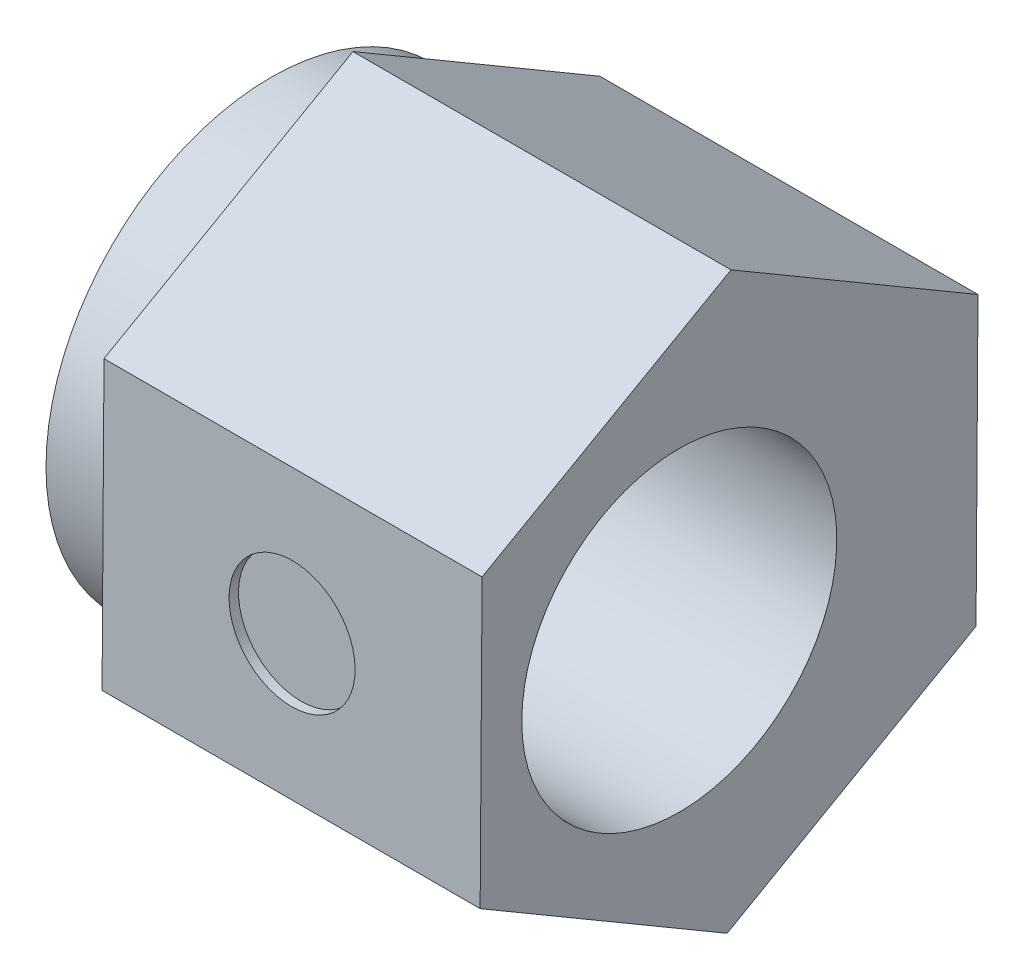
ISO-10303-21;
HEADER;
FILE_DESCRIPTION(('STEP AP214'),'2;1');
FILE_NAME('part.step','',(''),(''),'','','');
FILE_SCHEMA(('AUTOMOTIVE_DESIGN { 1 0 10303 214 1 1 1 1 }'));
ENDSEC;
DATA;
#1=APPLICATION_CONTEXT('core data for automotive mechanical design processes');
#2=APPLICATION_PROTOCOL_DEFINITION('international standard','automotive_design',2000,#1);
#3=PRODUCT_CONTEXT('',#1,'mechanical');
#4=PRODUCT('Part','Part','',(#3));
#5=PRODUCT_RELATED_PRODUCT_CATEGORY('part','',(#4));
#6=PRODUCT_DEFINITION_FORMATION('','',#4);
#7=PRODUCT_DEFINITION_CONTEXT('part definition',#1,'design');
#8=PRODUCT_DEFINITION('design','',#6,#7);
#9=PRODUCT_DEFINITION_SHAPE('','',#8);
#10=(LENGTH_UNIT() NAMED_UNIT(*) SI_UNIT(.MILLI.,.METRE.));
#11=(NAMED_UNIT(*) PLANE_ANGLE_UNIT() SI_UNIT($,.RADIAN.));
#12=(NAMED_UNIT(*) SI_UNIT($,.STERADIAN.) SOLID_ANGLE_UNIT());
#13=UNCERTAINTY_MEASURE_WITH_UNIT(LENGTH_MEASURE(1.E-05),#10,'distance_accuracy_value','');
#14=(GEOMETRIC_REPRESENTATION_CONTEXT(3) GLOBAL_UNCERTAINTY_ASSIGNED_CONTEXT((#13)) GLOBAL_UNIT_ASSIGNED_CONTEXT((#10,
#11,#12)) REPRESENTATION_CONTEXT('',''));
#15=CARTESIAN_POINT('',(0.,0.,0.));
#16=DIRECTION('',(0.,0.,1.));
#17=DIRECTION('',(1.,0.,0.));
#18=AXIS2_PLACEMENT_3D('',#15,#16,#17);
#19=CARTESIAN_POINT('',(6.,2.29861751972744,3.91943756568916));
#20=DIRECTION('',(0.,-0.00680988299330344,-0.999976812477978));
#21=DIRECTION('',(0.,0.999976812477978,-0.00680988299330344));
#22=AXIS2_PLACEMENT_3D('',#19,#20,#21);
#23=PLANE('',#22);
#24=DIRECTION('',(0.,-0.999976812477978,0.00680988299330344));
#25=VECTOR('',#24,1.);
#26=CARTESIAN_POINT('',(0.,2.29861751972744,3.91943756568916));
#27=LINE('',#26,#25);
#28=CARTESIAN_POINT('',(0.,2.29861751972744,3.91943756568916));
#29=VERTEX_POINT('',#28);
#30=CARTESIAN_POINT('',(0.,-2.24502374057014,3.95037994851252));
#31=VERTEX_POINT('',#30);
#32=EDGE_CURVE('E73',#29,#31,#27,.T.);
#33=ORIENTED_EDGE('',*,*,#32,.T.);
#34=DIRECTION('',(-1.,0.,0.));
#35=VECTOR('',#34,1.);
#36=CARTESIAN_POINT('',(6.,-2.24502374057014,3.95037994851252));
#37=LINE('',#36,#35);
#38=CARTESIAN_POINT('',(6.,-2.24502374057014,3.95037994851252));
#39=VERTEX_POINT('',#38);
#40=EDGE_CURVE('E111',#39,#31,#37,.T.);
#41=ORIENTED_EDGE('',*,*,#40,.F.);
#42=DIRECTION('',(0.,-0.999976812477978,0.00680988299330344));
#43=VECTOR('',#42,1.);
#44=CARTESIAN_POINT('',(6.,2.29861751972744,3.91943756568916));
#45=LINE('',#44,#43);
#46=CARTESIAN_POINT('',(6.,2.29861751972744,3.91943756568916));
#47=VERTEX_POINT('',#46);
#48=EDGE_CURVE('E99',#47,#39,#45,.T.);
#49=ORIENTED_EDGE('',*,*,#48,.F.);
#50=DIRECTION('',(-1.,0.,0.));
#51=VECTOR('',#50,1.);
#52=CARTESIAN_POINT('',(6.,2.29861751972744,3.91943756568916));
#53=LINE('',#52,#51);
#54=EDGE_CURVE('E106',#47,#29,#53,.T.);
#55=ORIENTED_EDGE('',*,*,#54,.T.);
#56=EDGE_LOOP('',(#33,#41,#49,#55));
#57=FACE_BOUND('',#56,.T.);
#58=CARTESIAN_POINT('',(3.,0.026796889578649,3.93490875710084));
#59=DIRECTION('',(0.,-0.00680988299330344,-0.999976812477978));
#60=DIRECTION('',(0.,0.999976812477978,-0.00680988299330344));
#61=AXIS2_PLACEMENT_3D('',#58,#59,#60);
#62=CIRCLE('',#61,0.999999999999998);
#63=CARTESIAN_POINT('',(3.,-0.973179922899328,3.94171864009414));
#64=VERTEX_POINT('',#63);
#65=EDGE_CURVE('E159',#64,#64,#62,.T.);
#66=ORIENTED_EDGE('',*,*,#65,.T.);
#67=EDGE_LOOP('',(#66));
#68=FACE_BOUND('',#67,.T.);
#69=ADVANCED_FACE('F33',(#57,#68),#23,.F.);
#70=CARTESIAN_POINT('',(0.,0.,0.));
#71=DIRECTION('',(1.,0.,0.));
#72=DIRECTION('',(0.,0.,-1.));
#73=AXIS2_PLACEMENT_3D('',#70,#71,#72);
#74=PLANE('',#73);
#75=DIRECTION('',(0.,0.494090874569989,-0.869410264297968));
#76=VECTOR('',#75,1.);
#77=CARTESIAN_POINT('',(0.,-4.54364126029758,0.0309423828233433));
#78=LINE('',#77,#76);
#79=CARTESIAN_POINT('',(0.,-4.54364126029758,0.0309423828233433));
#80=VERTEX_POINT('',#79);
#81=CARTESIAN_POINT('',(0.,-2.29861751972745,-3.91943756568916));
#82=VERTEX_POINT('',#81);
#83=EDGE_CURVE('E119',#80,#82,#78,.T.);
#84=ORIENTED_EDGE('',*,*,#83,.F.);
#85=DIRECTION('',(0.,-0.50588593790799,-0.862600381304665));
#86=VECTOR('',#85,1.);
#87=CARTESIAN_POINT('',(0.,-2.24502374057014,3.95037994851252));
#88=LINE('',#87,#86);
#89=EDGE_CURVE('E79',#31,#80,#88,.T.);
#90=ORIENTED_EDGE('',*,*,#89,.F.);
#91=ORIENTED_EDGE('',*,*,#32,.F.);
#92=DIRECTION('',(0.,-0.494090874569989,0.869410264297968));
#93=VECTOR('',#92,1.);
#94=CARTESIAN_POINT('',(0.,4.54364126029758,-0.0309423828233572));
#95=LINE('',#94,#93);
#96=CARTESIAN_POINT('',(0.,4.54364126029758,-0.0309423828233572));
#97=VERTEX_POINT('',#96);
#98=EDGE_CURVE('E109',#97,#29,#95,.T.);
#99=ORIENTED_EDGE('',*,*,#98,.F.);
#100=DIRECTION('',(0.,0.505885937907989,0.862600381304665));
#101=VECTOR('',#100,1.);
#102=CARTESIAN_POINT('',(0.,2.24502374057014,-3.95037994851252));
#103=LINE('',#102,#101);
#104=CARTESIAN_POINT('',(0.,2.24502374057014,-3.95037994851252));
#105=VERTEX_POINT('',#104);
#106=EDGE_CURVE('E125',#105,#97,#103,.T.);
#107=ORIENTED_EDGE('',*,*,#106,.F.);
#108=DIRECTION('',(0.,0.999976812477978,-0.00680988299330266));
#109=VECTOR('',#108,1.);
#110=CARTESIAN_POINT('',(0.,-2.29861751972745,-3.91943756568916));
#111=LINE('',#110,#109);
#112=EDGE_CURVE('E122',#82,#105,#111,.T.);
#113=ORIENTED_EDGE('',*,*,#112,.F.);
#114=EDGE_LOOP('',(#84,#90,#91,#99,#107,#113));
#115=FACE_BOUND('',#114,.T.);
#116=CARTESIAN_POINT('',(0.,0.,0.));
#117=DIRECTION('',(1.,0.,0.));
#118=DIRECTION('',(0.,0.,-1.));
#119=AXIS2_PLACEMENT_3D('',#116,#117,#118);
#120=CIRCLE('',#119,3.57);
#121=CARTESIAN_POINT('',(0.,0.,-3.57));
#122=VERTEX_POINT('',#121);
#123=EDGE_CURVE('E11',#122,#122,#120,.F.);
#124=ORIENTED_EDGE('',*,*,#123,.F.);
#125=EDGE_LOOP('',(#124));
#126=FACE_BOUND('',#125,.T.);
#127=ADVANCED_FACE('F142',(#115,#126),#74,.F.);
#128=CARTESIAN_POINT('',(6.,-4.54364126029758,0.0309423828233433));
#129=DIRECTION('',(0.,0.869410264297968,0.494090874569989));
#130=DIRECTION('',(0.,-0.494090874569989,0.869410264297969));
#131=AXIS2_PLACEMENT_3D('',#128,#129,#130);
#132=PLANE('',#131);
#133=ORIENTED_EDGE('',*,*,#83,.T.);
#134=DIRECTION('',(-1.,0.,0.));
#135=VECTOR('',#134,1.);
#136=CARTESIAN_POINT('',(6.,-2.29861751972745,-3.91943756568916));
#137=LINE('',#136,#135);
#138=CARTESIAN_POINT('',(6.,-2.29861751972745,-3.91943756568916));
#139=VERTEX_POINT('',#138);
#140=EDGE_CURVE('E42',#139,#82,#137,.T.);
#141=ORIENTED_EDGE('',*,*,#140,.F.);
#142=DIRECTION('',(0.,0.494090874569989,-0.869410264297968));
#143=VECTOR('',#142,1.);
#144=CARTESIAN_POINT('',(6.,-4.54364126029758,0.0309423828233433));
#145=LINE('',#144,#143);
#146=CARTESIAN_POINT('',(6.,-4.54364126029758,0.0309423828233433));
#147=VERTEX_POINT('',#146);
#148=EDGE_CURVE('E130',#147,#139,#145,.T.);
#149=ORIENTED_EDGE('',*,*,#148,.F.);
#150=DIRECTION('',(-1.,0.,0.));
#151=VECTOR('',#150,1.);
#152=CARTESIAN_POINT('',(6.,-4.54364126029758,0.0309423828233433));
#153=LINE('',#152,#151);
#154=EDGE_CURVE('E115',#147,#80,#153,.T.);
#155=ORIENTED_EDGE('',*,*,#154,.T.);
#156=EDGE_LOOP('',(#133,#141,#149,#155));
#157=FACE_BOUND('',#156,.T.);
#158=ADVANCED_FACE('F35',(#157),#132,.F.);
#159=CARTESIAN_POINT('',(6.,-2.29861751972745,-3.91943756568916));
#160=DIRECTION('',(0.,0.00680988299330266,0.999976812477978));
#161=DIRECTION('',(0.,-0.999976812477978,0.00680988299330266));
#162=AXIS2_PLACEMENT_3D('',#159,#160,#161);
#163=PLANE('',#162);
#164=ORIENTED_EDGE('',*,*,#112,.T.);
#165=DIRECTION('',(-1.,0.,0.));
#166=VECTOR('',#165,1.);
#167=CARTESIAN_POINT('',(6.,2.24502374057014,-3.95037994851252));
#168=LINE('',#167,#166);
#169=CARTESIAN_POINT('',(6.,2.24502374057014,-3.95037994851252));
#170=VERTEX_POINT('',#169);
#171=EDGE_CURVE('E134',#170,#105,#168,.T.);
#172=ORIENTED_EDGE('',*,*,#171,.F.);
#173=DIRECTION('',(0.,0.999976812477978,-0.00680988299330266));
#174=VECTOR('',#173,1.);
#175=CARTESIAN_POINT('',(6.,-2.29861751972745,-3.91943756568916));
#176=LINE('',#175,#174);
#177=EDGE_CURVE('E88',#139,#170,#176,.T.);
#178=ORIENTED_EDGE('',*,*,#177,.F.);
#179=ORIENTED_EDGE('',*,*,#140,.T.);
#180=EDGE_LOOP('',(#164,#172,#178,#179));
#181=FACE_BOUND('',#180,.T.);
#182=ADVANCED_FACE('F137',(#181),#163,.F.);
#183=CARTESIAN_POINT('',(6.,2.24502374057014,-3.95037994851252));
#184=DIRECTION('',(0.,-0.862600381304665,0.50588593790799));
#185=DIRECTION('',(0.,-0.50588593790799,-0.862600381304665));
#186=AXIS2_PLACEMENT_3D('',#183,#184,#185);
#187=PLANE('',#186);
#188=ORIENTED_EDGE('',*,*,#106,.T.);
#189=DIRECTION('',(-1.,0.,0.));
#190=VECTOR('',#189,1.);
#191=CARTESIAN_POINT('',(6.,4.54364126029758,-0.0309423828233572));
#192=LINE('',#191,#190);
#193=CARTESIAN_POINT('',(6.,4.54364126029758,-0.0309423828233572));
#194=VERTEX_POINT('',#193);
#195=EDGE_CURVE('E110',#194,#97,#192,.T.);
#196=ORIENTED_EDGE('',*,*,#195,.F.);
#197=DIRECTION('',(0.,0.505885937907989,0.862600381304665));
#198=VECTOR('',#197,1.);
#199=CARTESIAN_POINT('',(6.,2.24502374057014,-3.95037994851252));
#200=LINE('',#199,#198);
#201=EDGE_CURVE('E101',#170,#194,#200,.T.);
#202=ORIENTED_EDGE('',*,*,#201,.F.);
#203=ORIENTED_EDGE('',*,*,#171,.T.);
#204=EDGE_LOOP('',(#188,#196,#202,#203));
#205=FACE_BOUND('',#204,.T.);
#206=ADVANCED_FACE('F146',(#205),#187,.F.);
#207=CARTESIAN_POINT('',(6.,4.54364126029758,-0.0309423828233572));
#208=DIRECTION('',(0.,-0.869410264297968,-0.494090874569989));
#209=DIRECTION('',(0.,0.494090874569989,-0.869410264297969));
#210=AXIS2_PLACEMENT_3D('',#207,#208,#209);
#211=PLANE('',#210);
#212=ORIENTED_EDGE('',*,*,#98,.T.);
#213=ORIENTED_EDGE('',*,*,#54,.F.);
#214=DIRECTION('',(0.,-0.494090874569989,0.869410264297968));
#215=VECTOR('',#214,1.);
#216=CARTESIAN_POINT('',(6.,4.54364126029758,-0.0309423828233572));
#217=LINE('',#216,#215);
#218=EDGE_CURVE('E95',#194,#47,#217,.T.);
#219=ORIENTED_EDGE('',*,*,#218,.F.);
#220=ORIENTED_EDGE('',*,*,#195,.T.);
#221=EDGE_LOOP('',(#212,#213,#219,#220));
#222=FACE_BOUND('',#221,.T.);
#223=ADVANCED_FACE('F107',(#222),#211,.F.);
#224=CARTESIAN_POINT('',(6.,-2.24502374057014,3.95037994851252));
#225=DIRECTION('',(0.,0.862600381304665,-0.50588593790799));
#226=DIRECTION('',(0.,0.50588593790799,0.862600381304665));
#227=AXIS2_PLACEMENT_3D('',#224,#225,#226);
#228=PLANE('',#227);
#229=ORIENTED_EDGE('',*,*,#89,.T.);
#230=ORIENTED_EDGE('',*,*,#154,.F.);
#231=DIRECTION('',(0.,-0.50588593790799,-0.862600381304665));
#232=VECTOR('',#231,1.);
#233=CARTESIAN_POINT('',(6.,-2.24502374057014,3.95037994851252));
#234=LINE('',#233,#232);
#235=EDGE_CURVE('E50',#39,#147,#234,.T.);
#236=ORIENTED_EDGE('',*,*,#235,.F.);
#237=ORIENTED_EDGE('',*,*,#40,.T.);
#238=EDGE_LOOP('',(#229,#230,#236,#237));
#239=FACE_BOUND('',#238,.T.);
#240=ADVANCED_FACE('F184',(#239),#228,.F.);
#241=CARTESIAN_POINT('',(6.,0.,0.));
#242=DIRECTION('',(1.,0.,0.));
#243=DIRECTION('',(0.,0.,-1.));
#244=AXIS2_PLACEMENT_3D('',#241,#242,#243);
#245=PLANE('',#244);
#246=CARTESIAN_POINT('',(6.,0.,0.79));
#247=DIRECTION('',(-1.,0.,0.));
#248=DIRECTION('',(0.,0.,1.));
#249=AXIS2_PLACEMENT_3D('',#246,#247,#248);
#250=CIRCLE('',#249,2.5);
#251=CARTESIAN_POINT('',(6.,0.,3.29));
#252=VERTEX_POINT('',#251);
#253=EDGE_CURVE('E152',#252,#252,#250,.T.);
#254=ORIENTED_EDGE('',*,*,#253,.T.);
#255=EDGE_LOOP('',(#254));
#256=FACE_BOUND('',#255,.T.);
#257=ORIENTED_EDGE('',*,*,#148,.T.);
#258=ORIENTED_EDGE('',*,*,#177,.T.);
#259=ORIENTED_EDGE('',*,*,#201,.T.);
#260=ORIENTED_EDGE('',*,*,#218,.T.);
#261=ORIENTED_EDGE('',*,*,#48,.T.);
#262=ORIENTED_EDGE('',*,*,#235,.T.);
#263=EDGE_LOOP('',(#257,#258,#259,#260,#261,#262));
#264=FACE_BOUND('',#263,.T.);
#265=ADVANCED_FACE('F97',(#256,#264),#245,.T.);
#266=CARTESIAN_POINT('',(-1.27,0.,0.));
#267=DIRECTION('',(1.,0.,0.));
#268=DIRECTION('',(0.,0.,-1.));
#269=AXIS2_PLACEMENT_3D('',#266,#267,#268);
#270=CYLINDRICAL_SURFACE('',#269,3.57);
#271=CARTESIAN_POINT('',(-1.27,0.,0.));
#272=DIRECTION('',(-1.,0.,0.));
#273=DIRECTION('',(0.,0.,1.));
#274=AXIS2_PLACEMENT_3D('',#271,#272,#273);
#275=CIRCLE('',#274,3.57);
#276=CARTESIAN_POINT('',(-1.27,0.,3.57));
#277=VERTEX_POINT('',#276);
#278=EDGE_CURVE('E123',#277,#277,#275,.T.);
#279=ORIENTED_EDGE('',*,*,#278,.F.);
#280=EDGE_LOOP('',(#279));
#281=FACE_BOUND('',#280,.T.);
#282=ORIENTED_EDGE('',*,*,#123,.T.);
#283=EDGE_LOOP('',(#282));
#284=FACE_BOUND('',#283,.T.);
#285=ADVANCED_FACE('F210',(#281,#284),#270,.T.);
#286=CARTESIAN_POINT('',(-1.27,0.,0.));
#287=DIRECTION('',(-1.,0.,0.));
#288=DIRECTION('',(0.,0.,1.));
#289=AXIS2_PLACEMENT_3D('',#286,#287,#288);
#290=PLANE('',#289);
#291=CARTESIAN_POINT('',(-1.27,0.,0.79));
#292=DIRECTION('',(-1.,0.,0.));
#293=DIRECTION('',(0.,0.,1.));
#294=AXIS2_PLACEMENT_3D('',#291,#292,#293);
#295=CIRCLE('',#294,2.5);
#296=CARTESIAN_POINT('',(-1.27,0.,3.29));
#297=VERTEX_POINT('',#296);
#298=EDGE_CURVE('E153',#297,#297,#295,.T.);
#299=ORIENTED_EDGE('',*,*,#298,.F.);
#300=EDGE_LOOP('',(#299));
#301=FACE_BOUND('',#300,.T.);
#302=ORIENTED_EDGE('',*,*,#278,.T.);
#303=EDGE_LOOP('',(#302));
#304=FACE_BOUND('',#303,.T.);
#305=ADVANCED_FACE('F214',(#301,#304),#290,.T.);
#306=CARTESIAN_POINT('',(6.,0.,0.79));
#307=DIRECTION('',(-1.,0.,0.));
#308=DIRECTION('',(0.,0.,1.));
#309=AXIS2_PLACEMENT_3D('',#306,#307,#308);
#310=CYLINDRICAL_SURFACE('',#309,2.5);
#311=ORIENTED_EDGE('',*,*,#253,.F.);
#312=EDGE_LOOP('',(#311));
#313=FACE_BOUND('',#312,.T.);
#314=ORIENTED_EDGE('',*,*,#298,.T.);
#315=EDGE_LOOP('',(#314));
#316=FACE_BOUND('',#315,.T.);
#317=ADVANCED_FACE('F174',(#313,#316),#310,.F.);
#318=CARTESIAN_POINT('',(3.,0.0257754071296535,3.78491223522914));
#319=DIRECTION('',(0.,0.00680988299330344,0.999976812477978));
#320=DIRECTION('',(0.,-0.999976812477978,0.00680988299330344));
#321=AXIS2_PLACEMENT_3D('',#318,#319,#320);
#322=CYLINDRICAL_SURFACE('',#321,0.999999999999998);
#323=CARTESIAN_POINT('',(3.,0.0257754071296535,3.78491223522914));
#324=DIRECTION('',(0.,-0.00680988299330344,-0.999976812477978));
#325=DIRECTION('',(0.,0.999976812477978,-0.00680988299330344));
#326=AXIS2_PLACEMENT_3D('',#323,#324,#325);
#327=CIRCLE('',#326,0.999999999999998);
#328=CARTESIAN_POINT('',(3.,-0.974201405348323,3.79172211822245));
#329=VERTEX_POINT('',#328);
#330=EDGE_CURVE('E156',#329,#329,#327,.T.);
#331=CARTESIAN_POINT('',(3.,-0.974201405348323,3.79172211822245));
#332=CARTESIAN_POINT('',(3.,-0.974190764906146,3.79328458199194));
#333=CARTESIAN_POINT('',(3.,-0.974180124463969,3.79484704576144));
#334=CARTESIAN_POINT('',(3.,-0.974158843579615,3.79797197330043));
#335=CARTESIAN_POINT('',(3.,-0.974148203137438,3.79953443706993));
#336=CARTESIAN_POINT('',(3.,-0.974126922253084,3.80265936460892));
#337=CARTESIAN_POINT('',(3.,-0.974116281810907,3.80422182837842));
#338=CARTESIAN_POINT('',(3.,-0.974095000926553,3.80734675591741));
#339=CARTESIAN_POINT('',(3.,-0.974084360484376,3.80890921968691));
#340=CARTESIAN_POINT('',(3.,-0.974063079600021,3.8120341472259));
#341=CARTESIAN_POINT('',(3.,-0.974052439157845,3.8135966109954));
#342=CARTESIAN_POINT('',(3.,-0.97403115827349,3.8167215385344));
#343=CARTESIAN_POINT('',(3.,-0.974020517831313,3.81828400230389));
#344=CARTESIAN_POINT('',(3.,-0.973999236946959,3.82140892984289));
#345=CARTESIAN_POINT('',(3.,-0.973988596504782,3.82297139361238));
#346=CARTESIAN_POINT('',(3.,-0.973967315620428,3.82609632115138));
#347=CARTESIAN_POINT('',(3.,-0.973956675178251,3.82765878492087));
#348=CARTESIAN_POINT('',(3.,-0.973935394293897,3.83078371245987));
#349=CARTESIAN_POINT('',(3.,-0.97392475385172,3.83234617622936));
#350=CARTESIAN_POINT('',(3.,-0.973903472967366,3.83547110376836));
#351=CARTESIAN_POINT('',(3.,-0.973892832525189,3.83703356753785));
#352=CARTESIAN_POINT('',(3.,-0.973871551640835,3.84015849507685));
#353=CARTESIAN_POINT('',(3.,-0.973860911198658,3.84172095884634));
#354=CARTESIAN_POINT('',(3.,-0.973839630314304,3.84484588638534));
#355=CARTESIAN_POINT('',(3.,-0.973828989872127,3.84640835015484));
#356=CARTESIAN_POINT('',(3.,-0.973807708987773,3.84953327769383));
#357=CARTESIAN_POINT('',(3.,-0.973797068545596,3.85109574146333));
#358=CARTESIAN_POINT('',(3.,-0.973775787661241,3.85422066900232));
#359=CARTESIAN_POINT('',(3.,-0.973765147219064,3.85578313277182));
#360=CARTESIAN_POINT('',(3.,-0.97374386633471,3.85890806031081));
#361=CARTESIAN_POINT('',(3.,-0.973733225892534,3.86047052408031));
#362=CARTESIAN_POINT('',(3.,-0.973711945008179,3.8635954516193));
#363=CARTESIAN_POINT('',(3.,-0.973701304566002,3.8651579153888));
#364=CARTESIAN_POINT('',(3.,-0.973680023681648,3.86828284292779));
#365=CARTESIAN_POINT('',(3.,-0.973669383239471,3.86984530669729));
#366=CARTESIAN_POINT('',(3.,-0.973648102355117,3.87297023423628));
#367=CARTESIAN_POINT('',(3.,-0.97363746191294,3.87453269800578));
#368=CARTESIAN_POINT('',(3.,-0.973616181028586,3.87765762554477));
#369=CARTESIAN_POINT('',(3.,-0.973605540586409,3.87922008931427));
#370=CARTESIAN_POINT('',(3.,-0.973584259702055,3.88234501685326));
#371=CARTESIAN_POINT('',(3.,-0.973573619259878,3.88390748062276));
#372=CARTESIAN_POINT('',(3.,-0.973552338375524,3.88703240816175));
#373=CARTESIAN_POINT('',(3.,-0.973541697933347,3.88859487193125));
#374=CARTESIAN_POINT('',(3.,-0.973520417048993,3.89171979947024));
#375=CARTESIAN_POINT('',(3.,-0.973509776606816,3.89328226323974));
#376=CARTESIAN_POINT('',(3.,-0.973488495722461,3.89640719077873));
#377=CARTESIAN_POINT('',(3.,-0.973477855280285,3.89796965454823));
#378=CARTESIAN_POINT('',(3.,-0.97345657439593,3.90109458208722));
#379=CARTESIAN_POINT('',(3.,-0.973445933953753,3.90265704585672));
#380=CARTESIAN_POINT('',(3.,-0.973424653069399,3.90578197339572));
#381=CARTESIAN_POINT('',(3.,-0.973414012627222,3.90734443716521));
#382=CARTESIAN_POINT('',(3.,-0.973392731742868,3.91046936470421));
#383=CARTESIAN_POINT('',(3.,-0.973382091300691,3.9120318284737));
#384=CARTESIAN_POINT('',(3.,-0.973360810416337,3.9151567560127));
#385=CARTESIAN_POINT('',(3.,-0.97335016997416,3.91671921978219));
#386=CARTESIAN_POINT('',(3.,-0.973328889089806,3.91984414732119));
#387=CARTESIAN_POINT('',(3.,-0.973318248647629,3.92140661109068));
#388=CARTESIAN_POINT('',(3.,-0.973296967763275,3.92453153862968));
#389=CARTESIAN_POINT('',(3.,-0.973286327321098,3.92609400239917));
#390=CARTESIAN_POINT('',(3.,-0.973265046436744,3.92921892993817));
#391=CARTESIAN_POINT('',(3.,-0.973254405994567,3.93078139370766));
#392=CARTESIAN_POINT('',(3.,-0.973233125110213,3.93390632124666));
#393=CARTESIAN_POINT('',(3.,-0.973222484668036,3.93546878501616));
#394=CARTESIAN_POINT('',(3.,-0.973201203783681,3.93859371255515));
#395=CARTESIAN_POINT('',(3.,-0.973190563341504,3.94015617632465));
#396=CARTESIAN_POINT('',(3.,-0.973179922899328,3.94171864009414));
#397=B_SPLINE_CURVE_WITH_KNOTS('',3,(#331,#332,#333,#334,#335,#336,#337,#338,#339,#340,#341,
#342,#343,#344,#345,#346,#347,#348,#349,#350,#351,#352,#353,#354,#355,#356,#357,#358,#359,#360,
#361,#362,#363,#364,#365,#366,#367,#368,#369,#370,#371,#372,#373,#374,#375,#376,#377,#378,#379,
#380,#381,#382,#383,#384,#385,#386,#387,#388,#389,#390,#391,#392,#393,#394,#395,#396),
.UNSPECIFIED.,.F.,.F.,(4,2,2,2,2,2,2,2,2,2,2,2,2,2,2,2,2,2,2,2,2,2,2,2,2,2,2,2,2,2,2,2,4),(0.,
0.00468750000000004,0.00937500000000009,0.0140625000000001,0.0187500000000002,
0.0234375000000002,0.0281250000000003,0.0328125000000003,0.0375000000000004,0.0421875000000004,
0.046875,0.0515625,0.0562500000000001,0.0609375000000001,0.0656250000000002,0.0703125000000002,
0.0750000000000003,0.0796875000000003,0.0843750000000003,0.0890624999999999,0.09375,0.0984375,
0.103125,0.1078125,0.1125,0.1171875,0.121875,0.1265625,0.13125,0.1359375,0.140625,0.1453125,
0.150000000000001),.UNSPECIFIED.);
#398=EDGE_CURVE('BSEAM165',#329,#64,#397,.T.);
#399=ORIENTED_EDGE('',*,*,#330,.T.);
#400=ORIENTED_EDGE('',*,*,#65,.F.);
#401=ORIENTED_EDGE('',*,*,#398,.T.);
#402=ORIENTED_EDGE('',*,*,#398,.F.);
#403=EDGE_LOOP('',(#399,#401,#400,#402));
#404=FACE_BOUND('',#403,.T.);
#405=ADVANCED_FACE('F165',(#404),#322,.F.);
#406=CARTESIAN_POINT('',(3.,0.0257754071296535,3.78491223522914));
#407=DIRECTION('',(0.,-0.00680988299330344,-0.999976812477978));
#408=DIRECTION('',(0.,0.999976812477978,-0.00680988299330344));
#409=AXIS2_PLACEMENT_3D('',#406,#407,#408);
#410=PLANE('',#409);
#411=ORIENTED_EDGE('',*,*,#330,.F.);
#412=EDGE_LOOP('',(#411));
#413=FACE_BOUND('',#412,.T.);
#414=ADVANCED_FACE('F168',(#413),#410,.F.);
#415=CLOSED_SHELL('',(#69,#127,#158,#182,#206,#223,#240,#265,#285,#305,#317,#405,#414));
#416=MANIFOLD_SOLID_BREP('B2',#415);
#417=ADVANCED_BREP_SHAPE_REPRESENTATION('',(#18,#416),#14);
#418=SHAPE_DEFINITION_REPRESENTATION(#9,#417);
ENDSEC;
END-ISO-10303-21;
